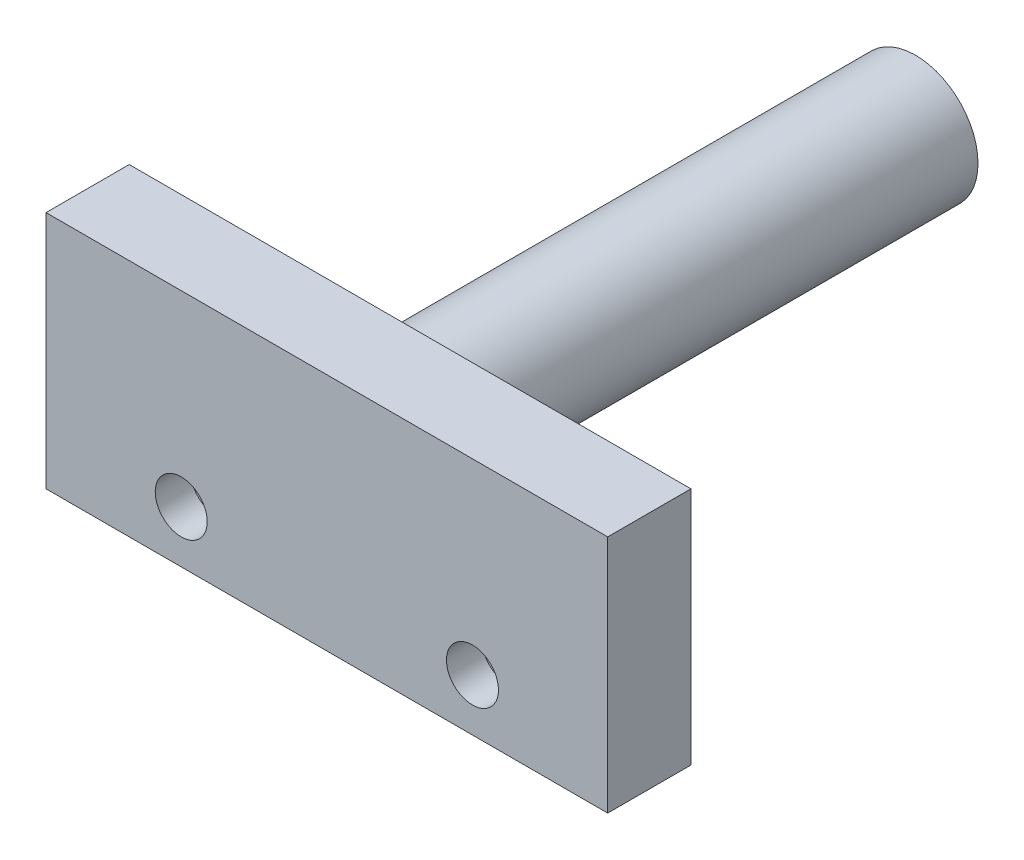
ISO-10303-21;
HEADER;
FILE_DESCRIPTION(('STEP AP214'),'2;1');
FILE_NAME('part.step','',(''),(''),'','','');
FILE_SCHEMA(('AUTOMOTIVE_DESIGN { 1 0 10303 214 1 1 1 1 }'));
ENDSEC;
DATA;
#1=APPLICATION_CONTEXT('core data for automotive mechanical design processes');
#2=APPLICATION_PROTOCOL_DEFINITION('international standard','automotive_design',2000,#1);
#3=PRODUCT_CONTEXT('',#1,'mechanical');
#4=PRODUCT('Part','Part','',(#3));
#5=PRODUCT_RELATED_PRODUCT_CATEGORY('part','',(#4));
#6=PRODUCT_DEFINITION_FORMATION('','',#4);
#7=PRODUCT_DEFINITION_CONTEXT('part definition',#1,'design');
#8=PRODUCT_DEFINITION('design','',#6,#7);
#9=PRODUCT_DEFINITION_SHAPE('','',#8);
#10=(LENGTH_UNIT() NAMED_UNIT(*) SI_UNIT(.MILLI.,.METRE.));
#11=(NAMED_UNIT(*) PLANE_ANGLE_UNIT() SI_UNIT($,.RADIAN.));
#12=(NAMED_UNIT(*) SI_UNIT($,.STERADIAN.) SOLID_ANGLE_UNIT());
#13=UNCERTAINTY_MEASURE_WITH_UNIT(LENGTH_MEASURE(1.E-05),#10,'distance_accuracy_value','');
#14=(GEOMETRIC_REPRESENTATION_CONTEXT(3) GLOBAL_UNCERTAINTY_ASSIGNED_CONTEXT((#13)) GLOBAL_UNIT_ASSIGNED_CONTEXT((#10,
#11,#12)) REPRESENTATION_CONTEXT('',''));
#15=CARTESIAN_POINT('',(0.,0.,0.));
#16=DIRECTION('',(0.,0.,1.));
#17=DIRECTION('',(1.,0.,0.));
#18=AXIS2_PLACEMENT_3D('',#15,#16,#17);
#19=CARTESIAN_POINT('',(-14.,-10.3,53.2));
#20=DIRECTION('',(0.,0.,-1.));
#21=DIRECTION('',(0.,-1.,0.));
#22=AXIS2_PLACEMENT_3D('',#19,#20,#21);
#23=CYLINDRICAL_SURFACE('',#22,3.5);
#24=CARTESIAN_POINT('',(-14.,-10.3,53.2));
#25=DIRECTION('',(0.,0.,-1.));
#26=DIRECTION('',(0.,-1.,0.));
#27=AXIS2_PLACEMENT_3D('',#24,#25,#26);
#28=CIRCLE('',#27,3.5);
#29=CARTESIAN_POINT('',(-14.,-13.8,53.2));
#30=VERTEX_POINT('',#29);
#31=EDGE_CURVE('E94',#30,#30,#28,.T.);
#32=ORIENTED_EDGE('',*,*,#31,.F.);
#33=EDGE_LOOP('',(#32));
#34=FACE_BOUND('',#33,.T.);
#35=CARTESIAN_POINT('',(-14.,-10.3,48.6));
#36=DIRECTION('',(0.,0.,-1.));
#37=DIRECTION('',(0.,-1.,0.));
#38=AXIS2_PLACEMENT_3D('',#35,#36,#37);
#39=CIRCLE('',#38,3.5);
#40=CARTESIAN_POINT('',(-14.,-13.8,48.6));
#41=VERTEX_POINT('',#40);
#42=EDGE_CURVE('E11',#41,#41,#39,.T.);
#43=ORIENTED_EDGE('',*,*,#42,.T.);
#44=EDGE_LOOP('',(#43));
#45=FACE_BOUND('',#44,.T.);
#46=ADVANCED_FACE('F16',(#34,#45),#23,.F.);
#47=CARTESIAN_POINT('',(14.,-10.3,53.2));
#48=DIRECTION('',(0.,0.,-1.));
#49=DIRECTION('',(0.,-1.,0.));
#50=AXIS2_PLACEMENT_3D('',#47,#48,#49);
#51=CYLINDRICAL_SURFACE('',#50,3.5);
#52=CARTESIAN_POINT('',(14.,-10.3,53.2));
#53=DIRECTION('',(0.,0.,-1.));
#54=DIRECTION('',(0.,-1.,0.));
#55=AXIS2_PLACEMENT_3D('',#52,#53,#54);
#56=CIRCLE('',#55,3.5);
#57=CARTESIAN_POINT('',(14.,-13.8,53.2));
#58=VERTEX_POINT('',#57);
#59=EDGE_CURVE('E154',#58,#58,#56,.T.);
#60=ORIENTED_EDGE('',*,*,#59,.F.);
#61=EDGE_LOOP('',(#60));
#62=FACE_BOUND('',#61,.T.);
#63=CARTESIAN_POINT('',(14.,-10.3,48.6));
#64=DIRECTION('',(0.,0.,-1.));
#65=DIRECTION('',(0.,-1.,0.));
#66=AXIS2_PLACEMENT_3D('',#63,#64,#65);
#67=CIRCLE('',#66,3.5);
#68=CARTESIAN_POINT('',(14.,-13.8,48.6));
#69=VERTEX_POINT('',#68);
#70=EDGE_CURVE('E26',#69,#69,#67,.T.);
#71=ORIENTED_EDGE('',*,*,#70,.T.);
#72=EDGE_LOOP('',(#71));
#73=FACE_BOUND('',#72,.T.);
#74=ADVANCED_FACE('F125',(#62,#73),#51,.F.);
#75=CARTESIAN_POINT('',(0.,0.,48.6));
#76=DIRECTION('',(0.,0.,-1.));
#77=DIRECTION('',(0.,-1.,0.));
#78=AXIS2_PLACEMENT_3D('',#75,#76,#77);
#79=CYLINDRICAL_SURFACE('',#78,6.);
#80=CARTESIAN_POINT('',(0.,0.,48.6));
#81=DIRECTION('',(0.,0.,1.));
#82=DIRECTION('',(1.,0.,0.));
#83=AXIS2_PLACEMENT_3D('',#80,#81,#82);
#84=CIRCLE('',#83,6.);
#85=CARTESIAN_POINT('',(6.,0.,48.6));
#86=VERTEX_POINT('',#85);
#87=EDGE_CURVE('E86',#86,#86,#84,.T.);
#88=ORIENTED_EDGE('',*,*,#87,.F.);
#89=EDGE_LOOP('',(#88));
#90=FACE_BOUND('',#89,.T.);
#91=CARTESIAN_POINT('',(0.,0.,0.));
#92=DIRECTION('',(0.,0.,1.));
#93=DIRECTION('',(1.,0.,0.));
#94=AXIS2_PLACEMENT_3D('',#91,#92,#93);
#95=CIRCLE('',#94,6.);
#96=CARTESIAN_POINT('',(6.,0.,0.));
#97=VERTEX_POINT('',#96);
#98=EDGE_CURVE('E97',#97,#97,#95,.T.);
#99=ORIENTED_EDGE('',*,*,#98,.T.);
#100=EDGE_LOOP('',(#99));
#101=FACE_BOUND('',#100,.T.);
#102=ADVANCED_FACE('F131',(#90,#101),#79,.T.);
#103=CARTESIAN_POINT('',(14.,-10.3,56.6));
#104=DIRECTION('',(0.,0.,-1.));
#105=DIRECTION('',(0.,-1.,0.));
#106=AXIS2_PLACEMENT_3D('',#103,#104,#105);
#107=CYLINDRICAL_SURFACE('',#106,2.5);
#108=CARTESIAN_POINT('',(14.,-10.3,56.6));
#109=DIRECTION('',(0.,0.,-1.));
#110=DIRECTION('',(0.,-1.,0.));
#111=AXIS2_PLACEMENT_3D('',#108,#109,#110);
#112=CIRCLE('',#111,2.5);
#113=CARTESIAN_POINT('',(14.,-12.8,56.6));
#114=VERTEX_POINT('',#113);
#115=EDGE_CURVE('E82',#114,#114,#112,.T.);
#116=ORIENTED_EDGE('',*,*,#115,.F.);
#117=EDGE_LOOP('',(#116));
#118=FACE_BOUND('',#117,.T.);
#119=CARTESIAN_POINT('',(14.,-10.3,53.2));
#120=DIRECTION('',(0.,0.,1.));
#121=DIRECTION('',(1.,0.,0.));
#122=AXIS2_PLACEMENT_3D('',#119,#120,#121);
#123=CIRCLE('',#122,2.5);
#124=CARTESIAN_POINT('',(16.5,-10.3,53.2));
#125=VERTEX_POINT('',#124);
#126=EDGE_CURVE('E90',#125,#125,#123,.T.);
#127=ORIENTED_EDGE('',*,*,#126,.F.);
#128=EDGE_LOOP('',(#127));
#129=FACE_BOUND('',#128,.T.);
#130=ADVANCED_FACE('F141',(#118,#129),#107,.F.);
#131=CARTESIAN_POINT('',(-14.,-10.3,56.6));
#132=DIRECTION('',(0.,0.,-1.));
#133=DIRECTION('',(0.,-1.,0.));
#134=AXIS2_PLACEMENT_3D('',#131,#132,#133);
#135=CYLINDRICAL_SURFACE('',#134,2.5);
#136=CARTESIAN_POINT('',(-14.,-10.3,56.6));
#137=DIRECTION('',(0.,0.,-1.));
#138=DIRECTION('',(0.,-1.,0.));
#139=AXIS2_PLACEMENT_3D('',#136,#137,#138);
#140=CIRCLE('',#139,2.5);
#141=CARTESIAN_POINT('',(-14.,-12.8,56.6));
#142=VERTEX_POINT('',#141);
#143=EDGE_CURVE('E80',#142,#142,#140,.T.);
#144=ORIENTED_EDGE('',*,*,#143,.F.);
#145=EDGE_LOOP('',(#144));
#146=FACE_BOUND('',#145,.T.);
#147=CARTESIAN_POINT('',(-14.,-10.3,53.2));
#148=DIRECTION('',(0.,0.,1.));
#149=DIRECTION('',(1.,0.,0.));
#150=AXIS2_PLACEMENT_3D('',#147,#148,#149);
#151=CIRCLE('',#150,2.5);
#152=CARTESIAN_POINT('',(-11.5,-10.3,53.2));
#153=VERTEX_POINT('',#152);
#154=EDGE_CURVE('E91',#153,#153,#151,.T.);
#155=ORIENTED_EDGE('',*,*,#154,.F.);
#156=EDGE_LOOP('',(#155));
#157=FACE_BOUND('',#156,.T.);
#158=ADVANCED_FACE('F18',(#146,#157),#135,.F.);
#159=CARTESIAN_POINT('',(0.,0.,0.));
#160=DIRECTION('',(0.,0.,1.));
#161=DIRECTION('',(1.,0.,0.));
#162=AXIS2_PLACEMENT_3D('',#159,#160,#161);
#163=PLANE('',#162);
#164=ORIENTED_EDGE('',*,*,#98,.F.);
#165=EDGE_LOOP('',(#164));
#166=FACE_BOUND('',#165,.T.);
#167=ADVANCED_FACE('F122',(#166),#163,.F.);
#168=CARTESIAN_POINT('',(27.,7.7,56.6));
#169=DIRECTION('',(-1.,0.,0.));
#170=DIRECTION('',(0.,0.,1.));
#171=AXIS2_PLACEMENT_3D('',#168,#169,#170);
#172=PLANE('',#171);
#173=DIRECTION('',(0.,1.,0.));
#174=VECTOR('',#173,1.);
#175=CARTESIAN_POINT('',(27.,7.7,48.6));
#176=LINE('',#175,#174);
#177=CARTESIAN_POINT('',(27.,-15.3,48.6));
#178=VERTEX_POINT('',#177);
#179=CARTESIAN_POINT('',(27.,7.7,48.6));
#180=VERTEX_POINT('',#179);
#181=EDGE_CURVE('E95',#178,#180,#176,.T.);
#182=ORIENTED_EDGE('',*,*,#181,.T.);
#183=DIRECTION('',(0.,0.,-1.));
#184=VECTOR('',#183,1.);
#185=CARTESIAN_POINT('',(27.,7.7,56.6));
#186=LINE('',#185,#184);
#187=CARTESIAN_POINT('',(27.,7.7,56.6));
#188=VERTEX_POINT('',#187);
#189=EDGE_CURVE('E35',#188,#180,#186,.T.);
#190=ORIENTED_EDGE('',*,*,#189,.F.);
#191=DIRECTION('',(0.,1.,0.));
#192=VECTOR('',#191,1.);
#193=CARTESIAN_POINT('',(27.,7.7,56.6));
#194=LINE('',#193,#192);
#195=CARTESIAN_POINT('',(27.,-15.3,56.6));
#196=VERTEX_POINT('',#195);
#197=EDGE_CURVE('E74',#196,#188,#194,.T.);
#198=ORIENTED_EDGE('',*,*,#197,.F.);
#199=DIRECTION('',(0.,0.,-1.));
#200=VECTOR('',#199,1.);
#201=CARTESIAN_POINT('',(27.,-15.3,56.6));
#202=LINE('',#201,#200);
#203=EDGE_CURVE('E79',#196,#178,#202,.T.);
#204=ORIENTED_EDGE('',*,*,#203,.T.);
#205=EDGE_LOOP('',(#182,#190,#198,#204));
#206=FACE_BOUND('',#205,.T.);
#207=ADVANCED_FACE('F112',(#206),#172,.F.);
#208=CARTESIAN_POINT('',(-27.,7.7,56.6));
#209=DIRECTION('',(0.,-1.,0.));
#210=DIRECTION('',(0.,0.,-1.));
#211=AXIS2_PLACEMENT_3D('',#208,#209,#210);
#212=PLANE('',#211);
#213=DIRECTION('',(-1.,0.,0.));
#214=VECTOR('',#213,1.);
#215=CARTESIAN_POINT('',(-27.,7.7,48.6));
#216=LINE('',#215,#214);
#217=CARTESIAN_POINT('',(-27.,7.7,48.6));
#218=VERTEX_POINT('',#217);
#219=EDGE_CURVE('E99',#180,#218,#216,.T.);
#220=ORIENTED_EDGE('',*,*,#219,.T.);
#221=DIRECTION('',(0.,0.,-1.));
#222=VECTOR('',#221,1.);
#223=CARTESIAN_POINT('',(-27.,7.7,56.6));
#224=LINE('',#223,#222);
#225=CARTESIAN_POINT('',(-27.,7.7,56.6));
#226=VERTEX_POINT('',#225);
#227=EDGE_CURVE('E103',#226,#218,#224,.T.);
#228=ORIENTED_EDGE('',*,*,#227,.F.);
#229=DIRECTION('',(-1.,0.,0.));
#230=VECTOR('',#229,1.);
#231=CARTESIAN_POINT('',(-27.,7.7,56.6));
#232=LINE('',#231,#230);
#233=EDGE_CURVE('E65',#188,#226,#232,.T.);
#234=ORIENTED_EDGE('',*,*,#233,.F.);
#235=ORIENTED_EDGE('',*,*,#189,.T.);
#236=EDGE_LOOP('',(#220,#228,#234,#235));
#237=FACE_BOUND('',#236,.T.);
#238=ADVANCED_FACE('F113',(#237),#212,.F.);
#239=CARTESIAN_POINT('',(-27.,7.7,56.6));
#240=DIRECTION('',(1.,0.,0.));
#241=DIRECTION('',(0.,0.,-1.));
#242=AXIS2_PLACEMENT_3D('',#239,#240,#241);
#243=PLANE('',#242);
#244=DIRECTION('',(0.,-1.,0.));
#245=VECTOR('',#244,1.);
#246=CARTESIAN_POINT('',(-27.,7.7,48.6));
#247=LINE('',#246,#245);
#248=CARTESIAN_POINT('',(-27.,-15.3,48.6));
#249=VERTEX_POINT('',#248);
#250=EDGE_CURVE('E71',#218,#249,#247,.T.);
#251=ORIENTED_EDGE('',*,*,#250,.T.);
#252=DIRECTION('',(0.,0.,-1.));
#253=VECTOR('',#252,1.);
#254=CARTESIAN_POINT('',(-27.,-15.3,56.6));
#255=LINE('',#254,#253);
#256=CARTESIAN_POINT('',(-27.,-15.3,56.6));
#257=VERTEX_POINT('',#256);
#258=EDGE_CURVE('E56',#257,#249,#255,.T.);
#259=ORIENTED_EDGE('',*,*,#258,.F.);
#260=DIRECTION('',(0.,-1.,0.));
#261=VECTOR('',#260,1.);
#262=CARTESIAN_POINT('',(-27.,7.7,56.6));
#263=LINE('',#262,#261);
#264=EDGE_CURVE('E62',#226,#257,#263,.T.);
#265=ORIENTED_EDGE('',*,*,#264,.F.);
#266=ORIENTED_EDGE('',*,*,#227,.T.);
#267=EDGE_LOOP('',(#251,#259,#265,#266));
#268=FACE_BOUND('',#267,.T.);
#269=ADVANCED_FACE('F69',(#268),#243,.F.);
#270=CARTESIAN_POINT('',(-27.,-15.3,56.6));
#271=DIRECTION('',(0.,1.,0.));
#272=DIRECTION('',(0.,0.,1.));
#273=AXIS2_PLACEMENT_3D('',#270,#271,#272);
#274=PLANE('',#273);
#275=DIRECTION('',(1.,0.,0.));
#276=VECTOR('',#275,1.);
#277=CARTESIAN_POINT('',(-27.,-15.3,48.6));
#278=LINE('',#277,#276);
#279=EDGE_CURVE('E73',#249,#178,#278,.T.);
#280=ORIENTED_EDGE('',*,*,#279,.T.);
#281=ORIENTED_EDGE('',*,*,#203,.F.);
#282=DIRECTION('',(1.,0.,0.));
#283=VECTOR('',#282,1.);
#284=CARTESIAN_POINT('',(-27.,-15.3,56.6));
#285=LINE('',#284,#283);
#286=EDGE_CURVE('E20',#257,#196,#285,.T.);
#287=ORIENTED_EDGE('',*,*,#286,.F.);
#288=ORIENTED_EDGE('',*,*,#258,.T.);
#289=EDGE_LOOP('',(#280,#281,#287,#288));
#290=FACE_BOUND('',#289,.T.);
#291=ADVANCED_FACE('F77',(#290),#274,.F.);
#292=CARTESIAN_POINT('',(0.,0.,56.6));
#293=DIRECTION('',(0.,0.,1.));
#294=DIRECTION('',(1.,0.,0.));
#295=AXIS2_PLACEMENT_3D('',#292,#293,#294);
#296=PLANE('',#295);
#297=ORIENTED_EDGE('',*,*,#197,.T.);
#298=ORIENTED_EDGE('',*,*,#233,.T.);
#299=ORIENTED_EDGE('',*,*,#264,.T.);
#300=ORIENTED_EDGE('',*,*,#286,.T.);
#301=EDGE_LOOP('',(#297,#298,#299,#300));
#302=FACE_BOUND('',#301,.T.);
#303=ORIENTED_EDGE('',*,*,#143,.T.);
#304=EDGE_LOOP('',(#303));
#305=FACE_BOUND('',#304,.T.);
#306=ORIENTED_EDGE('',*,*,#115,.T.);
#307=EDGE_LOOP('',(#306));
#308=FACE_BOUND('',#307,.T.);
#309=ADVANCED_FACE('F63',(#302,#305,#308),#296,.T.);
#310=CARTESIAN_POINT('',(0.,0.,48.6));
#311=DIRECTION('',(0.,0.,1.));
#312=DIRECTION('',(1.,0.,0.));
#313=AXIS2_PLACEMENT_3D('',#310,#311,#312);
#314=PLANE('',#313);
#315=ORIENTED_EDGE('',*,*,#181,.F.);
#316=ORIENTED_EDGE('',*,*,#279,.F.);
#317=ORIENTED_EDGE('',*,*,#250,.F.);
#318=ORIENTED_EDGE('',*,*,#219,.F.);
#319=EDGE_LOOP('',(#315,#316,#317,#318));
#320=FACE_BOUND('',#319,.T.);
#321=ORIENTED_EDGE('',*,*,#42,.F.);
#322=EDGE_LOOP('',(#321));
#323=FACE_BOUND('',#322,.T.);
#324=ORIENTED_EDGE('',*,*,#70,.F.);
#325=EDGE_LOOP('',(#324));
#326=FACE_BOUND('',#325,.T.);
#327=ORIENTED_EDGE('',*,*,#87,.T.);
#328=EDGE_LOOP('',(#327));
#329=FACE_BOUND('',#328,.T.);
#330=ADVANCED_FACE('F108',(#320,#323,#326,#329),#314,.F.);
#331=CARTESIAN_POINT('',(14.,-10.3,53.2));
#332=DIRECTION('',(0.,0.,-1.));
#333=DIRECTION('',(-1.,0.,0.));
#334=AXIS2_PLACEMENT_3D('',#331,#332,#333);
#335=PLANE('',#334);
#336=ORIENTED_EDGE('',*,*,#59,.T.);
#337=EDGE_LOOP('',(#336));
#338=FACE_BOUND('',#337,.T.);
#339=ORIENTED_EDGE('',*,*,#126,.T.);
#340=EDGE_LOOP('',(#339));
#341=FACE_BOUND('',#340,.T.);
#342=ADVANCED_FACE('F219',(#338,#341),#335,.T.);
#343=CARTESIAN_POINT('',(-14.,-10.3,53.2));
#344=DIRECTION('',(0.,0.,-1.));
#345=DIRECTION('',(-1.,0.,0.));
#346=AXIS2_PLACEMENT_3D('',#343,#344,#345);
#347=PLANE('',#346);
#348=ORIENTED_EDGE('',*,*,#31,.T.);
#349=EDGE_LOOP('',(#348));
#350=FACE_BOUND('',#349,.T.);
#351=ORIENTED_EDGE('',*,*,#154,.T.);
#352=EDGE_LOOP('',(#351));
#353=FACE_BOUND('',#352,.T.);
#354=ADVANCED_FACE('F137',(#350,#353),#347,.T.);
#355=CLOSED_SHELL('',(#46,#74,#102,#130,#158,#167,#207,#238,#269,#291,#309,#330,#342,#354));
#356=MANIFOLD_SOLID_BREP('B1',#355);
#357=ADVANCED_BREP_SHAPE_REPRESENTATION('',(#18,#356),#14);
#358=SHAPE_DEFINITION_REPRESENTATION(#9,#357);
ENDSEC;
END-ISO-10303-21;
